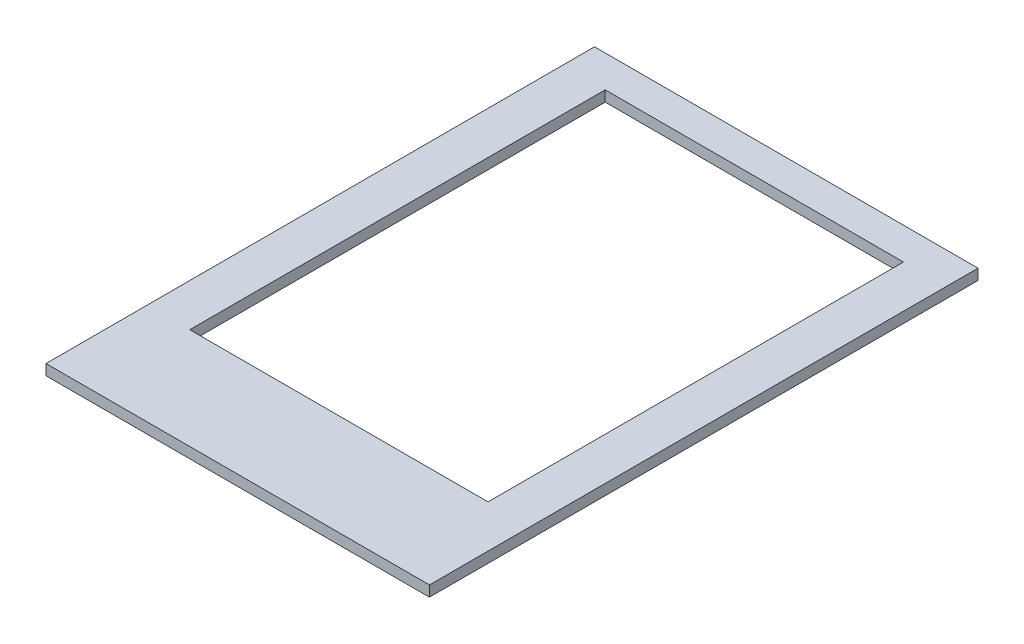
ISO-10303-21;
HEADER;
FILE_DESCRIPTION(('STEP AP214'),'2;1');
FILE_NAME('part.step','',(''),(''),'','','');
FILE_SCHEMA(('AUTOMOTIVE_DESIGN { 1 0 10303 214 1 1 1 1 }'));
ENDSEC;
DATA;
#1=APPLICATION_CONTEXT('core data for automotive mechanical design processes');
#2=APPLICATION_PROTOCOL_DEFINITION('international standard','automotive_design',2000,#1);
#3=PRODUCT_CONTEXT('',#1,'mechanical');
#4=PRODUCT('Part','Part','',(#3));
#5=PRODUCT_RELATED_PRODUCT_CATEGORY('part','',(#4));
#6=PRODUCT_DEFINITION_FORMATION('','',#4);
#7=PRODUCT_DEFINITION_CONTEXT('part definition',#1,'design');
#8=PRODUCT_DEFINITION('design','',#6,#7);
#9=PRODUCT_DEFINITION_SHAPE('','',#8);
#10=(LENGTH_UNIT() NAMED_UNIT(*) SI_UNIT(.MILLI.,.METRE.));
#11=(NAMED_UNIT(*) PLANE_ANGLE_UNIT() SI_UNIT($,.RADIAN.));
#12=(NAMED_UNIT(*) SI_UNIT($,.STERADIAN.) SOLID_ANGLE_UNIT());
#13=UNCERTAINTY_MEASURE_WITH_UNIT(LENGTH_MEASURE(1.E-05),#10,'distance_accuracy_value','');
#14=(GEOMETRIC_REPRESENTATION_CONTEXT(3) GLOBAL_UNCERTAINTY_ASSIGNED_CONTEXT((#13)) GLOBAL_UNIT_ASSIGNED_CONTEXT((#10,
#11,#12)) REPRESENTATION_CONTEXT('',''));
#15=CARTESIAN_POINT('',(0.,0.,0.));
#16=DIRECTION('',(0.,0.,1.));
#17=DIRECTION('',(1.,0.,0.));
#18=AXIS2_PLACEMENT_3D('',#15,#16,#17);
#19=CARTESIAN_POINT('',(0.,12.7,0.));
#20=DIRECTION('',(0.,-1.,0.));
#21=DIRECTION('',(0.,0.,-1.));
#22=AXIS2_PLACEMENT_3D('',#19,#20,#21);
#23=PLANE('',#22);
#24=DIRECTION('',(0.,0.,1.));
#25=VECTOR('',#24,1.);
#26=CARTESIAN_POINT('',(0.,12.7,0.));
#27=LINE('',#26,#25);
#28=CARTESIAN_POINT('',(0.,12.7,-654.05));
#29=VERTEX_POINT('',#28);
#30=CARTESIAN_POINT('',(0.,12.7,0.));
#31=VERTEX_POINT('',#30);
#32=EDGE_CURVE('E136',#29,#31,#27,.T.);
#33=ORIENTED_EDGE('',*,*,#32,.T.);
#34=DIRECTION('',(1.,0.,0.));
#35=VECTOR('',#34,1.);
#36=CARTESIAN_POINT('',(0.,12.7,0.));
#37=LINE('',#36,#35);
#38=CARTESIAN_POINT('',(457.2,12.7,0.));
#39=VERTEX_POINT('',#38);
#40=EDGE_CURVE('E139',#31,#39,#37,.T.);
#41=ORIENTED_EDGE('',*,*,#40,.T.);
#42=DIRECTION('',(0.,0.,-1.));
#43=VECTOR('',#42,1.);
#44=CARTESIAN_POINT('',(457.2,12.7,0.));
#45=LINE('',#44,#43);
#46=CARTESIAN_POINT('',(457.2,12.7,-654.05));
#47=VERTEX_POINT('',#46);
#48=EDGE_CURVE('E142',#39,#47,#45,.T.);
#49=ORIENTED_EDGE('',*,*,#48,.T.);
#50=DIRECTION('',(-1.,0.,0.));
#51=VECTOR('',#50,1.);
#52=CARTESIAN_POINT('',(0.,12.7,-654.05));
#53=LINE('',#52,#51);
#54=EDGE_CURVE('E144',#47,#29,#53,.T.);
#55=ORIENTED_EDGE('',*,*,#54,.T.);
#56=EDGE_LOOP('',(#33,#41,#49,#55));
#57=FACE_BOUND('',#56,.T.);
#58=DIRECTION('',(0.,0.,1.));
#59=VECTOR('',#58,1.);
#60=CARTESIAN_POINT('',(50.8,12.7,-615.95));
#61=LINE('',#60,#59);
#62=CARTESIAN_POINT('',(50.8,12.7,-615.95));
#63=VERTEX_POINT('',#62);
#64=CARTESIAN_POINT('',(50.8000000000001,12.7,-120.65));
#65=VERTEX_POINT('',#64);
#66=EDGE_CURVE('E100',#63,#65,#61,.T.);
#67=ORIENTED_EDGE('',*,*,#66,.F.);
#68=DIRECTION('',(-1.,0.,0.));
#69=VECTOR('',#68,1.);
#70=CARTESIAN_POINT('',(50.8,12.7,-615.95));
#71=LINE('',#70,#69);
#72=CARTESIAN_POINT('',(406.4,12.7,-615.95));
#73=VERTEX_POINT('',#72);
#74=EDGE_CURVE('E122',#73,#63,#71,.T.);
#75=ORIENTED_EDGE('',*,*,#74,.F.);
#76=DIRECTION('',(0.,0.,-1.));
#77=VECTOR('',#76,1.);
#78=CARTESIAN_POINT('',(406.4,12.7,-615.95));
#79=LINE('',#78,#77);
#80=CARTESIAN_POINT('',(406.4,12.7,-120.65));
#81=VERTEX_POINT('',#80);
#82=EDGE_CURVE('E120',#81,#73,#79,.T.);
#83=ORIENTED_EDGE('',*,*,#82,.F.);
#84=DIRECTION('',(1.,0.,0.));
#85=VECTOR('',#84,1.);
#86=CARTESIAN_POINT('',(50.8000000000001,12.7,-120.65));
#87=LINE('',#86,#85);
#88=EDGE_CURVE('E108',#65,#81,#87,.T.);
#89=ORIENTED_EDGE('',*,*,#88,.F.);
#90=EDGE_LOOP('',(#67,#75,#83,#89));
#91=FACE_BOUND('',#90,.T.);
#92=ADVANCED_FACE('F35',(#57,#91),#23,.F.);
#93=CARTESIAN_POINT('',(0.,0.,0.));
#94=DIRECTION('',(0.,-1.,0.));
#95=DIRECTION('',(0.,0.,-1.));
#96=AXIS2_PLACEMENT_3D('',#93,#94,#95);
#97=PLANE('',#96);
#98=DIRECTION('',(0.,0.,1.));
#99=VECTOR('',#98,1.);
#100=CARTESIAN_POINT('',(0.,0.,0.));
#101=LINE('',#100,#99);
#102=CARTESIAN_POINT('',(0.,0.,-654.05));
#103=VERTEX_POINT('',#102);
#104=CARTESIAN_POINT('',(0.,0.,0.));
#105=VERTEX_POINT('',#104);
#106=EDGE_CURVE('E116',#103,#105,#101,.T.);
#107=ORIENTED_EDGE('',*,*,#106,.F.);
#108=DIRECTION('',(-1.,0.,0.));
#109=VECTOR('',#108,1.);
#110=CARTESIAN_POINT('',(0.,0.,-654.05));
#111=LINE('',#110,#109);
#112=CARTESIAN_POINT('',(457.2,0.,-654.05));
#113=VERTEX_POINT('',#112);
#114=EDGE_CURVE('E140',#113,#103,#111,.T.);
#115=ORIENTED_EDGE('',*,*,#114,.F.);
#116=DIRECTION('',(0.,0.,-1.));
#117=VECTOR('',#116,1.);
#118=CARTESIAN_POINT('',(457.2,0.,0.));
#119=LINE('',#118,#117);
#120=CARTESIAN_POINT('',(457.2,0.,0.));
#121=VERTEX_POINT('',#120);
#122=EDGE_CURVE('E151',#121,#113,#119,.T.);
#123=ORIENTED_EDGE('',*,*,#122,.F.);
#124=DIRECTION('',(1.,0.,0.));
#125=VECTOR('',#124,1.);
#126=CARTESIAN_POINT('',(0.,0.,0.));
#127=LINE('',#126,#125);
#128=EDGE_CURVE('E149',#105,#121,#127,.T.);
#129=ORIENTED_EDGE('',*,*,#128,.F.);
#130=EDGE_LOOP('',(#107,#115,#123,#129));
#131=FACE_BOUND('',#130,.T.);
#132=DIRECTION('',(-1.,0.,0.));
#133=VECTOR('',#132,1.);
#134=CARTESIAN_POINT('',(50.8,0.,-615.95));
#135=LINE('',#134,#133);
#136=CARTESIAN_POINT('',(406.4,0.,-615.95));
#137=VERTEX_POINT('',#136);
#138=CARTESIAN_POINT('',(50.8,0.,-615.95));
#139=VERTEX_POINT('',#138);
#140=EDGE_CURVE('E109',#137,#139,#135,.T.);
#141=ORIENTED_EDGE('',*,*,#140,.T.);
#142=DIRECTION('',(0.,0.,1.));
#143=VECTOR('',#142,1.);
#144=CARTESIAN_POINT('',(50.8,0.,-615.95));
#145=LINE('',#144,#143);
#146=CARTESIAN_POINT('',(50.8000000000001,0.,-120.65));
#147=VERTEX_POINT('',#146);
#148=EDGE_CURVE('E58',#139,#147,#145,.T.);
#149=ORIENTED_EDGE('',*,*,#148,.T.);
#150=DIRECTION('',(1.,0.,0.));
#151=VECTOR('',#150,1.);
#152=CARTESIAN_POINT('',(50.8000000000001,0.,-120.65));
#153=LINE('',#152,#151);
#154=CARTESIAN_POINT('',(406.4,0.,-120.65));
#155=VERTEX_POINT('',#154);
#156=EDGE_CURVE('E115',#147,#155,#153,.T.);
#157=ORIENTED_EDGE('',*,*,#156,.T.);
#158=DIRECTION('',(0.,0.,-1.));
#159=VECTOR('',#158,1.);
#160=CARTESIAN_POINT('',(406.4,0.,-615.95));
#161=LINE('',#160,#159);
#162=EDGE_CURVE('E128',#155,#137,#161,.T.);
#163=ORIENTED_EDGE('',*,*,#162,.T.);
#164=EDGE_LOOP('',(#141,#149,#157,#163));
#165=FACE_BOUND('',#164,.T.);
#166=ADVANCED_FACE('F169',(#131,#165),#97,.T.);
#167=CARTESIAN_POINT('',(0.,12.7,0.));
#168=DIRECTION('',(1.,0.,0.));
#169=DIRECTION('',(0.,0.,-1.));
#170=AXIS2_PLACEMENT_3D('',#167,#168,#169);
#171=PLANE('',#170);
#172=ORIENTED_EDGE('',*,*,#106,.T.);
#173=DIRECTION('',(0.,-1.,0.));
#174=VECTOR('',#173,1.);
#175=CARTESIAN_POINT('',(0.,12.7,0.));
#176=LINE('',#175,#174);
#177=EDGE_CURVE('E11',#31,#105,#176,.T.);
#178=ORIENTED_EDGE('',*,*,#177,.F.);
#179=ORIENTED_EDGE('',*,*,#32,.F.);
#180=DIRECTION('',(0.,-1.,0.));
#181=VECTOR('',#180,1.);
#182=CARTESIAN_POINT('',(0.,12.7,-654.05));
#183=LINE('',#182,#181);
#184=EDGE_CURVE('E146',#29,#103,#183,.T.);
#185=ORIENTED_EDGE('',*,*,#184,.T.);
#186=EDGE_LOOP('',(#172,#178,#179,#185));
#187=FACE_BOUND('',#186,.T.);
#188=ADVANCED_FACE('F37',(#187),#171,.F.);
#189=CARTESIAN_POINT('',(0.,12.7,0.));
#190=DIRECTION('',(0.,0.,-1.));
#191=DIRECTION('',(-1.,0.,0.));
#192=AXIS2_PLACEMENT_3D('',#189,#190,#191);
#193=PLANE('',#192);
#194=ORIENTED_EDGE('',*,*,#128,.T.);
#195=DIRECTION('',(0.,-1.,0.));
#196=VECTOR('',#195,1.);
#197=CARTESIAN_POINT('',(457.2,12.7,0.));
#198=LINE('',#197,#196);
#199=EDGE_CURVE('E43',#39,#121,#198,.T.);
#200=ORIENTED_EDGE('',*,*,#199,.F.);
#201=ORIENTED_EDGE('',*,*,#40,.F.);
#202=ORIENTED_EDGE('',*,*,#177,.T.);
#203=EDGE_LOOP('',(#194,#200,#201,#202));
#204=FACE_BOUND('',#203,.T.);
#205=ADVANCED_FACE('F179',(#204),#193,.F.);
#206=CARTESIAN_POINT('',(457.2,12.7,0.));
#207=DIRECTION('',(-1.,0.,0.));
#208=DIRECTION('',(0.,0.,1.));
#209=AXIS2_PLACEMENT_3D('',#206,#207,#208);
#210=PLANE('',#209);
#211=ORIENTED_EDGE('',*,*,#122,.T.);
#212=DIRECTION('',(0.,-1.,0.));
#213=VECTOR('',#212,1.);
#214=CARTESIAN_POINT('',(457.2,12.7,-654.05));
#215=LINE('',#214,#213);
#216=EDGE_CURVE('E156',#47,#113,#215,.T.);
#217=ORIENTED_EDGE('',*,*,#216,.F.);
#218=ORIENTED_EDGE('',*,*,#48,.F.);
#219=ORIENTED_EDGE('',*,*,#199,.T.);
#220=EDGE_LOOP('',(#211,#217,#218,#219));
#221=FACE_BOUND('',#220,.T.);
#222=ADVANCED_FACE('F163',(#221),#210,.F.);
#223=CARTESIAN_POINT('',(0.,12.7,-654.05));
#224=DIRECTION('',(0.,0.,1.));
#225=DIRECTION('',(1.,0.,0.));
#226=AXIS2_PLACEMENT_3D('',#223,#224,#225);
#227=PLANE('',#226);
#228=ORIENTED_EDGE('',*,*,#114,.T.);
#229=ORIENTED_EDGE('',*,*,#184,.F.);
#230=ORIENTED_EDGE('',*,*,#54,.F.);
#231=ORIENTED_EDGE('',*,*,#216,.T.);
#232=EDGE_LOOP('',(#228,#229,#230,#231));
#233=FACE_BOUND('',#232,.T.);
#234=ADVANCED_FACE('F173',(#233),#227,.F.);
#235=CARTESIAN_POINT('',(50.8,12.7,-615.95));
#236=DIRECTION('',(1.,0.,0.));
#237=DIRECTION('',(0.,0.,-1.));
#238=AXIS2_PLACEMENT_3D('',#235,#236,#237);
#239=PLANE('',#238);
#240=ORIENTED_EDGE('',*,*,#148,.F.);
#241=DIRECTION('',(0.,-1.,0.));
#242=VECTOR('',#241,1.);
#243=CARTESIAN_POINT('',(50.8,12.7,-615.95));
#244=LINE('',#243,#242);
#245=EDGE_CURVE('E104',#63,#139,#244,.T.);
#246=ORIENTED_EDGE('',*,*,#245,.F.);
#247=ORIENTED_EDGE('',*,*,#66,.T.);
#248=DIRECTION('',(0.,-1.,0.));
#249=VECTOR('',#248,1.);
#250=CARTESIAN_POINT('',(50.8000000000001,12.7,-120.65));
#251=LINE('',#250,#249);
#252=EDGE_CURVE('E103',#65,#147,#251,.T.);
#253=ORIENTED_EDGE('',*,*,#252,.T.);
#254=EDGE_LOOP('',(#240,#246,#247,#253));
#255=FACE_BOUND('',#254,.T.);
#256=ADVANCED_FACE('F102',(#255),#239,.T.);
#257=CARTESIAN_POINT('',(50.8000000000001,12.7,-120.65));
#258=DIRECTION('',(0.,0.,-1.));
#259=DIRECTION('',(-1.,0.,0.));
#260=AXIS2_PLACEMENT_3D('',#257,#258,#259);
#261=PLANE('',#260);
#262=ORIENTED_EDGE('',*,*,#156,.F.);
#263=ORIENTED_EDGE('',*,*,#252,.F.);
#264=ORIENTED_EDGE('',*,*,#88,.T.);
#265=DIRECTION('',(0.,-1.,0.));
#266=VECTOR('',#265,1.);
#267=CARTESIAN_POINT('',(406.4,12.7,-120.65));
#268=LINE('',#267,#266);
#269=EDGE_CURVE('E117',#81,#155,#268,.T.);
#270=ORIENTED_EDGE('',*,*,#269,.T.);
#271=EDGE_LOOP('',(#262,#263,#264,#270));
#272=FACE_BOUND('',#271,.T.);
#273=ADVANCED_FACE('F112',(#272),#261,.T.);
#274=CARTESIAN_POINT('',(406.4,12.7,-615.95));
#275=DIRECTION('',(-1.,0.,0.));
#276=DIRECTION('',(0.,0.,1.));
#277=AXIS2_PLACEMENT_3D('',#274,#275,#276);
#278=PLANE('',#277);
#279=ORIENTED_EDGE('',*,*,#162,.F.);
#280=ORIENTED_EDGE('',*,*,#269,.F.);
#281=ORIENTED_EDGE('',*,*,#82,.T.);
#282=DIRECTION('',(0.,-1.,0.));
#283=VECTOR('',#282,1.);
#284=CARTESIAN_POINT('',(406.4,12.7,-615.95));
#285=LINE('',#284,#283);
#286=EDGE_CURVE('E50',#73,#137,#285,.T.);
#287=ORIENTED_EDGE('',*,*,#286,.T.);
#288=EDGE_LOOP('',(#279,#280,#281,#287));
#289=FACE_BOUND('',#288,.T.);
#290=ADVANCED_FACE('F202',(#289),#278,.T.);
#291=CARTESIAN_POINT('',(50.8,12.7,-615.95));
#292=DIRECTION('',(0.,0.,1.));
#293=DIRECTION('',(1.,0.,0.));
#294=AXIS2_PLACEMENT_3D('',#291,#292,#293);
#295=PLANE('',#294);
#296=ORIENTED_EDGE('',*,*,#140,.F.);
#297=ORIENTED_EDGE('',*,*,#286,.F.);
#298=ORIENTED_EDGE('',*,*,#74,.T.);
#299=ORIENTED_EDGE('',*,*,#245,.T.);
#300=EDGE_LOOP('',(#296,#297,#298,#299));
#301=FACE_BOUND('',#300,.T.);
#302=ADVANCED_FACE('F206',(#301),#295,.T.);
#303=CLOSED_SHELL('',(#92,#166,#188,#205,#222,#234,#256,#273,#290,#302));
#304=MANIFOLD_SOLID_BREP('B2',#303);
#305=ADVANCED_BREP_SHAPE_REPRESENTATION('',(#18,#304),#14);
#306=SHAPE_DEFINITION_REPRESENTATION(#9,#305);
ENDSEC;
END-ISO-10303-21;
